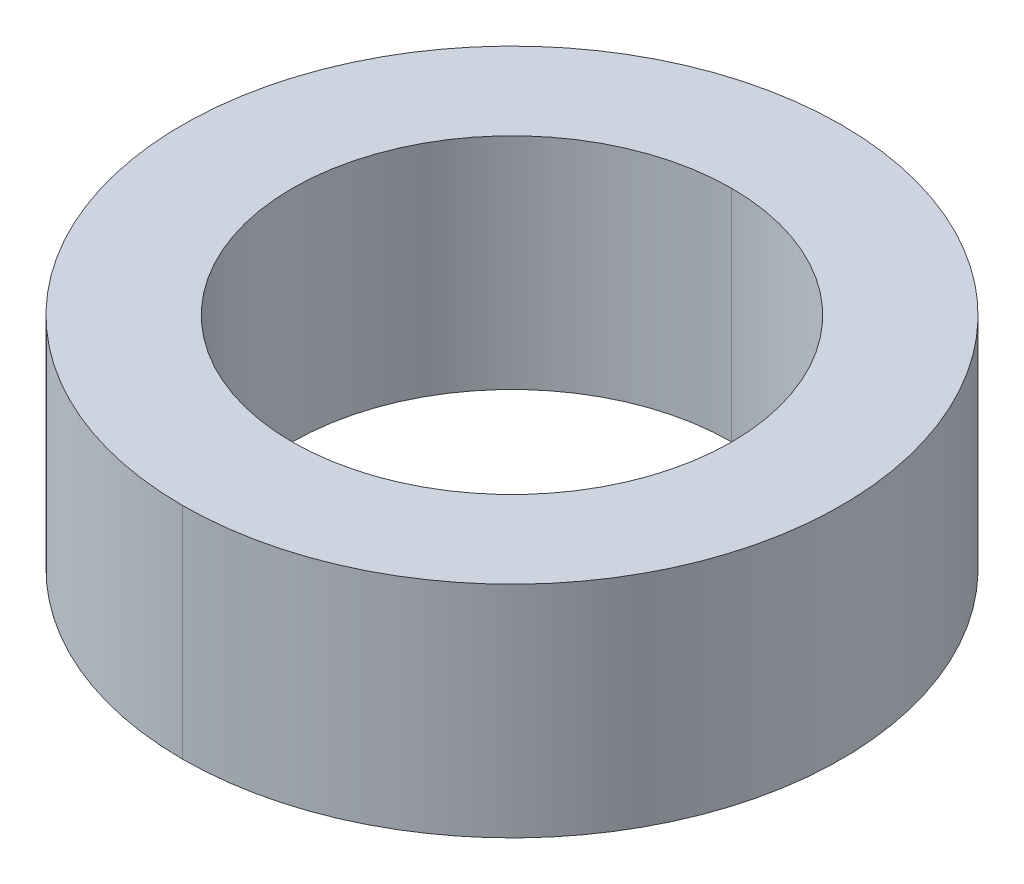
ISO-10303-21;
HEADER;
FILE_DESCRIPTION(('STEP AP214'),'2;1');
FILE_NAME('part.step','',(''),(''),'','','');
FILE_SCHEMA(('AUTOMOTIVE_DESIGN { 1 0 10303 214 1 1 1 1 }'));
ENDSEC;
DATA;
#1=APPLICATION_CONTEXT('core data for automotive mechanical design processes');
#2=APPLICATION_PROTOCOL_DEFINITION('international standard','automotive_design',2000,#1);
#3=PRODUCT_CONTEXT('',#1,'mechanical');
#4=PRODUCT('Part','Part','',(#3));
#5=PRODUCT_RELATED_PRODUCT_CATEGORY('part','',(#4));
#6=PRODUCT_DEFINITION_FORMATION('','',#4);
#7=PRODUCT_DEFINITION_CONTEXT('part definition',#1,'design');
#8=PRODUCT_DEFINITION('design','',#6,#7);
#9=PRODUCT_DEFINITION_SHAPE('','',#8);
#10=(LENGTH_UNIT() NAMED_UNIT(*) SI_UNIT(.MILLI.,.METRE.));
#11=(NAMED_UNIT(*) PLANE_ANGLE_UNIT() SI_UNIT($,.RADIAN.));
#12=(NAMED_UNIT(*) SI_UNIT($,.STERADIAN.) SOLID_ANGLE_UNIT());
#13=UNCERTAINTY_MEASURE_WITH_UNIT(LENGTH_MEASURE(1.E-05),#10,'distance_accuracy_value','');
#14=(GEOMETRIC_REPRESENTATION_CONTEXT(3) GLOBAL_UNCERTAINTY_ASSIGNED_CONTEXT((#13)) GLOBAL_UNIT_ASSIGNED_CONTEXT((#10,
#11,#12)) REPRESENTATION_CONTEXT('',''));
#15=CARTESIAN_POINT('',(0.,0.,0.));
#16=DIRECTION('',(0.,0.,1.));
#17=DIRECTION('',(1.,0.,0.));
#18=AXIS2_PLACEMENT_3D('',#15,#16,#17);
#19=CARTESIAN_POINT('',(0.,3.,0.));
#20=DIRECTION('',(0.,-1.,0.));
#21=DIRECTION('',(0.,0.,-1.));
#22=AXIS2_PLACEMENT_3D('',#19,#20,#21);
#23=CYLINDRICAL_SURFACE('',#22,3.);
#24=DIRECTION('',(0.,-1.,0.));
#25=VECTOR('',#24,1.);
#26=CARTESIAN_POINT('',(0.,3.,3.));
#27=LINE('',#26,#25);
#28=CARTESIAN_POINT('',(0.,3.,3.));
#29=VERTEX_POINT('',#28);
#30=CARTESIAN_POINT('',(0.,0.,3.));
#31=VERTEX_POINT('',#30);
#32=EDGE_CURVE('E87',#29,#31,#27,.T.);
#33=ORIENTED_EDGE('',*,*,#32,.F.);
#34=CARTESIAN_POINT('',(0.,3.,0.));
#35=DIRECTION('',(0.,1.,0.));
#36=DIRECTION('',(0.,0.,1.));
#37=AXIS2_PLACEMENT_3D('',#34,#35,#36);
#38=CIRCLE('',#37,3.);
#39=CARTESIAN_POINT('',(0.,3.,-3.));
#40=VERTEX_POINT('',#39);
#41=EDGE_CURVE('E79',#29,#40,#38,.T.);
#42=ORIENTED_EDGE('',*,*,#41,.T.);
#43=DIRECTION('',(0.,-1.,0.));
#44=VECTOR('',#43,1.);
#45=CARTESIAN_POINT('',(0.,3.,-3.));
#46=LINE('',#45,#44);
#47=CARTESIAN_POINT('',(0.,0.,-3.));
#48=VERTEX_POINT('',#47);
#49=EDGE_CURVE('E78',#40,#48,#46,.T.);
#50=ORIENTED_EDGE('',*,*,#49,.T.);
#51=CARTESIAN_POINT('',(0.,0.,0.));
#52=DIRECTION('',(0.,1.,0.));
#53=DIRECTION('',(0.,0.,1.));
#54=AXIS2_PLACEMENT_3D('',#51,#52,#53);
#55=CIRCLE('',#54,3.);
#56=EDGE_CURVE('E11',#31,#48,#55,.T.);
#57=ORIENTED_EDGE('',*,*,#56,.F.);
#58=EDGE_LOOP('',(#33,#42,#50,#57));
#59=FACE_BOUND('',#58,.T.);
#60=ADVANCED_FACE('F18',(#59),#23,.F.);
#61=CARTESIAN_POINT('',(0.,3.,0.));
#62=DIRECTION('',(0.,-1.,0.));
#63=DIRECTION('',(0.,0.,-1.));
#64=AXIS2_PLACEMENT_3D('',#61,#62,#63);
#65=CYLINDRICAL_SURFACE('',#64,4.5);
#66=DIRECTION('',(0.,-1.,0.));
#67=VECTOR('',#66,1.);
#68=CARTESIAN_POINT('',(0.,3.,4.5));
#69=LINE('',#68,#67);
#70=CARTESIAN_POINT('',(0.,3.,4.5));
#71=VERTEX_POINT('',#70);
#72=CARTESIAN_POINT('',(0.,0.,4.5));
#73=VERTEX_POINT('',#72);
#74=EDGE_CURVE('E98',#71,#73,#69,.T.);
#75=ORIENTED_EDGE('',*,*,#74,.F.);
#76=CARTESIAN_POINT('',(0.,3.,0.));
#77=DIRECTION('',(0.,1.,0.));
#78=DIRECTION('',(0.,0.,1.));
#79=AXIS2_PLACEMENT_3D('',#76,#77,#78);
#80=CIRCLE('',#79,4.5);
#81=CARTESIAN_POINT('',(0.,3.,-4.5));
#82=VERTEX_POINT('',#81);
#83=EDGE_CURVE('E103',#82,#71,#80,.T.);
#84=ORIENTED_EDGE('',*,*,#83,.F.);
#85=DIRECTION('',(0.,-1.,0.));
#86=VECTOR('',#85,1.);
#87=CARTESIAN_POINT('',(0.,3.,-4.5));
#88=LINE('',#87,#86);
#89=CARTESIAN_POINT('',(0.,0.,-4.5));
#90=VERTEX_POINT('',#89);
#91=EDGE_CURVE('E106',#82,#90,#88,.T.);
#92=ORIENTED_EDGE('',*,*,#91,.T.);
#93=CARTESIAN_POINT('',(0.,0.,0.));
#94=DIRECTION('',(0.,1.,0.));
#95=DIRECTION('',(0.,0.,1.));
#96=AXIS2_PLACEMENT_3D('',#93,#94,#95);
#97=CIRCLE('',#96,4.5);
#98=EDGE_CURVE('E21',#90,#73,#97,.T.);
#99=ORIENTED_EDGE('',*,*,#98,.T.);
#100=EDGE_LOOP('',(#75,#84,#92,#99));
#101=FACE_BOUND('',#100,.T.);
#102=ADVANCED_FACE('F150',(#101),#65,.T.);
#103=CARTESIAN_POINT('',(0.,0.,0.));
#104=DIRECTION('',(0.,1.,0.));
#105=DIRECTION('',(1.,0.,0.));
#106=AXIS2_PLACEMENT_3D('',#103,#104,#105);
#107=PLANE('',#106);
#108=CARTESIAN_POINT('',(0.,0.,0.));
#109=DIRECTION('',(0.,1.,0.));
#110=DIRECTION('',(0.,0.,1.));
#111=AXIS2_PLACEMENT_3D('',#108,#109,#110);
#112=CIRCLE('',#111,3.);
#113=EDGE_CURVE('E72',#48,#31,#112,.T.);
#114=ORIENTED_EDGE('',*,*,#113,.T.);
#115=ORIENTED_EDGE('',*,*,#56,.T.);
#116=EDGE_LOOP('',(#114,#115));
#117=FACE_BOUND('',#116,.T.);
#118=ORIENTED_EDGE('',*,*,#98,.F.);
#119=CARTESIAN_POINT('',(0.,0.,0.));
#120=DIRECTION('',(0.,1.,0.));
#121=DIRECTION('',(0.,0.,1.));
#122=AXIS2_PLACEMENT_3D('',#119,#120,#121);
#123=CIRCLE('',#122,4.5);
#124=EDGE_CURVE('E102',#73,#90,#123,.T.);
#125=ORIENTED_EDGE('',*,*,#124,.F.);
#126=EDGE_LOOP('',(#118,#125));
#127=FACE_BOUND('',#126,.T.);
#128=ADVANCED_FACE('F70',(#117,#127),#107,.F.);
#129=CARTESIAN_POINT('',(0.,3.,0.));
#130=DIRECTION('',(0.,1.,0.));
#131=DIRECTION('',(1.,0.,0.));
#132=AXIS2_PLACEMENT_3D('',#129,#130,#131);
#133=PLANE('',#132);
#134=CARTESIAN_POINT('',(0.,3.,0.));
#135=DIRECTION('',(0.,1.,0.));
#136=DIRECTION('',(0.,0.,1.));
#137=AXIS2_PLACEMENT_3D('',#134,#135,#136);
#138=CIRCLE('',#137,3.);
#139=EDGE_CURVE('E94',#40,#29,#138,.T.);
#140=ORIENTED_EDGE('',*,*,#139,.F.);
#141=ORIENTED_EDGE('',*,*,#41,.F.);
#142=EDGE_LOOP('',(#140,#141));
#143=FACE_BOUND('',#142,.T.);
#144=ORIENTED_EDGE('',*,*,#83,.T.);
#145=CARTESIAN_POINT('',(0.,3.,0.));
#146=DIRECTION('',(0.,1.,0.));
#147=DIRECTION('',(0.,0.,1.));
#148=AXIS2_PLACEMENT_3D('',#145,#146,#147);
#149=CIRCLE('',#148,4.5);
#150=EDGE_CURVE('E84',#71,#82,#149,.T.);
#151=ORIENTED_EDGE('',*,*,#150,.T.);
#152=EDGE_LOOP('',(#144,#151));
#153=FACE_BOUND('',#152,.T.);
#154=ADVANCED_FACE('F138',(#143,#153),#133,.T.);
#155=CARTESIAN_POINT('',(0.,3.,0.));
#156=DIRECTION('',(0.,-1.,0.));
#157=DIRECTION('',(0.,0.,-1.));
#158=AXIS2_PLACEMENT_3D('',#155,#156,#157);
#159=CYLINDRICAL_SURFACE('',#158,4.5);
#160=ORIENTED_EDGE('',*,*,#150,.F.);
#161=ORIENTED_EDGE('',*,*,#74,.T.);
#162=ORIENTED_EDGE('',*,*,#124,.T.);
#163=ORIENTED_EDGE('',*,*,#91,.F.);
#164=EDGE_LOOP('',(#160,#161,#162,#163));
#165=FACE_BOUND('',#164,.T.);
#166=ADVANCED_FACE('F127',(#165),#159,.T.);
#167=CARTESIAN_POINT('',(0.,3.,0.));
#168=DIRECTION('',(0.,-1.,0.));
#169=DIRECTION('',(0.,0.,-1.));
#170=AXIS2_PLACEMENT_3D('',#167,#168,#169);
#171=CYLINDRICAL_SURFACE('',#170,3.);
#172=ORIENTED_EDGE('',*,*,#139,.T.);
#173=ORIENTED_EDGE('',*,*,#32,.T.);
#174=ORIENTED_EDGE('',*,*,#113,.F.);
#175=ORIENTED_EDGE('',*,*,#49,.F.);
#176=EDGE_LOOP('',(#172,#173,#174,#175));
#177=FACE_BOUND('',#176,.T.);
#178=ADVANCED_FACE('F86',(#177),#171,.F.);
#179=CLOSED_SHELL('',(#60,#102,#128,#154,#166,#178));
#180=MANIFOLD_SOLID_BREP('B1',#179);
#181=ADVANCED_BREP_SHAPE_REPRESENTATION('',(#18,#180),#14);
#182=SHAPE_DEFINITION_REPRESENTATION(#9,#181);
ENDSEC;
END-ISO-10303-21;
